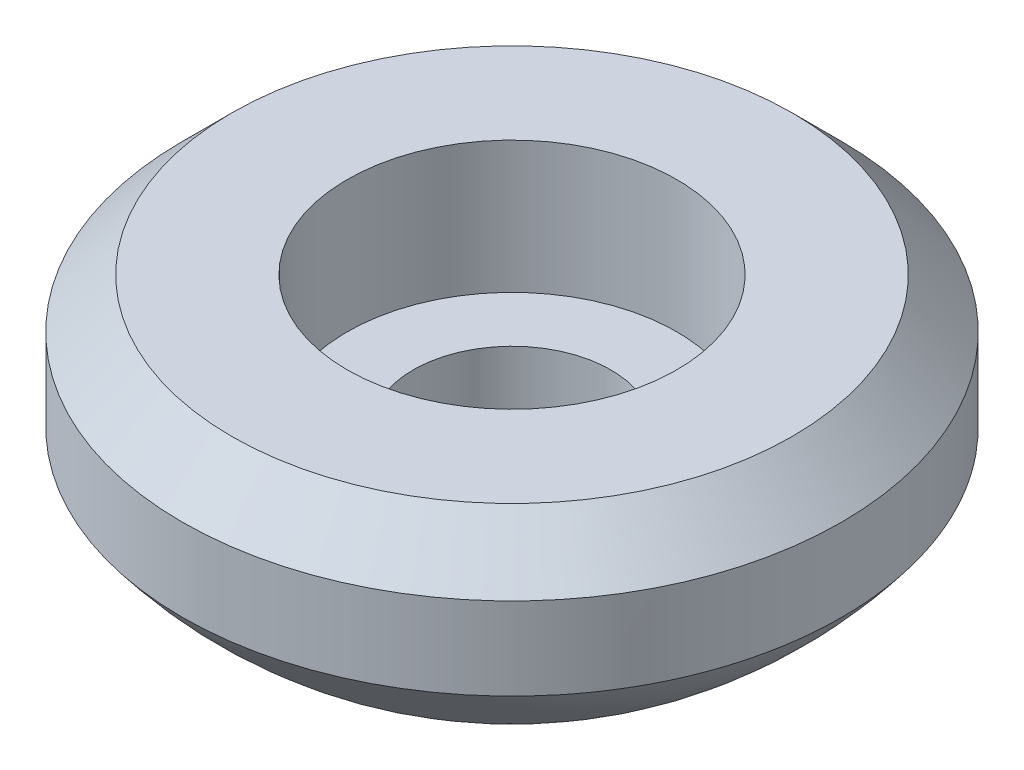
ISO-10303-21;
HEADER;
FILE_DESCRIPTION(('STEP AP214'),'2;1');
FILE_NAME('part.step','',(''),(''),'','','');
FILE_SCHEMA(('AUTOMOTIVE_DESIGN { 1 0 10303 214 1 1 1 1 }'));
ENDSEC;
DATA;
#1=APPLICATION_CONTEXT('core data for automotive mechanical design processes');
#2=APPLICATION_PROTOCOL_DEFINITION('international standard','automotive_design',2000,#1);
#3=PRODUCT_CONTEXT('',#1,'mechanical');
#4=PRODUCT('Part','Part','',(#3));
#5=PRODUCT_RELATED_PRODUCT_CATEGORY('part','',(#4));
#6=PRODUCT_DEFINITION_FORMATION('','',#4);
#7=PRODUCT_DEFINITION_CONTEXT('part definition',#1,'design');
#8=PRODUCT_DEFINITION('design','',#6,#7);
#9=PRODUCT_DEFINITION_SHAPE('','',#8);
#10=(LENGTH_UNIT() NAMED_UNIT(*) SI_UNIT(.MILLI.,.METRE.));
#11=(NAMED_UNIT(*) PLANE_ANGLE_UNIT() SI_UNIT($,.RADIAN.));
#12=(NAMED_UNIT(*) SI_UNIT($,.STERADIAN.) SOLID_ANGLE_UNIT());
#13=UNCERTAINTY_MEASURE_WITH_UNIT(LENGTH_MEASURE(1.E-05),#10,'distance_accuracy_value','');
#14=(GEOMETRIC_REPRESENTATION_CONTEXT(3) GLOBAL_UNCERTAINTY_ASSIGNED_CONTEXT((#13)) GLOBAL_UNIT_ASSIGNED_CONTEXT((#10,
#11,#12)) REPRESENTATION_CONTEXT('',''));
#15=CARTESIAN_POINT('',(0.,0.,0.));
#16=DIRECTION('',(0.,0.,1.));
#17=DIRECTION('',(1.,0.,0.));
#18=AXIS2_PLACEMENT_3D('',#15,#16,#17);
#19=CARTESIAN_POINT('',(0.,25.0000000000002,0.));
#20=DIRECTION('',(-1.,0.,0.));
#21=DIRECTION('',(0.,0.,1.));
#22=AXIS2_PLACEMENT_3D('',#19,#20,#21);
#23=SPHERICAL_SURFACE('',#22,25.0000000000002);
#24=CARTESIAN_POINT('',(0.,9.99999999999971,0.));
#25=DIRECTION('',(0.,1.,0.));
#26=DIRECTION('',(0.,0.,1.));
#27=AXIS2_PLACEMENT_3D('',#24,#25,#26);
#28=CIRCLE('',#27,19.9999999999999);
#29=CARTESIAN_POINT('',(0.,9.99999999999971,19.9999999999999));
#30=VERTEX_POINT('',#29);
#31=EDGE_CURVE('E82',#30,#30,#28,.T.);
#32=ORIENTED_EDGE('',*,*,#31,.F.);
#33=EDGE_LOOP('',(#32));
#34=FACE_BOUND('',#33,.T.);
#35=CARTESIAN_POINT('',(0.,0.73067780097677,0.));
#36=DIRECTION('',(0.,1.,0.));
#37=DIRECTION('',(0.,0.,1.));
#38=AXIS2_PLACEMENT_3D('',#35,#36,#37);
#39=CIRCLE('',#38,5.99999999999999);
#40=CARTESIAN_POINT('',(0.,0.73067780097677,5.99999999999999));
#41=VERTEX_POINT('',#40);
#42=EDGE_CURVE('E55',#41,#41,#39,.T.);
#43=ORIENTED_EDGE('',*,*,#42,.T.);
#44=EDGE_LOOP('',(#43));
#45=FACE_BOUND('',#44,.T.);
#46=ADVANCED_FACE('F35',(#34,#45),#23,.T.);
#47=CARTESIAN_POINT('',(0.,18.,0.));
#48=DIRECTION('',(0.,-1.,0.));
#49=DIRECTION('',(0.,0.,-1.));
#50=AXIS2_PLACEMENT_3D('',#47,#48,#49);
#51=CYLINDRICAL_SURFACE('',#50,19.9999999999999);
#52=CARTESIAN_POINT('',(0.,15.,0.));
#53=DIRECTION('',(0.,1.,0.));
#54=DIRECTION('',(0.,0.,1.));
#55=AXIS2_PLACEMENT_3D('',#52,#53,#54);
#56=CIRCLE('',#55,19.9999999999999);
#57=CARTESIAN_POINT('',(0.,15.,-19.9999999999999));
#58=VERTEX_POINT('',#57);
#59=EDGE_CURVE('E10',#58,#58,#56,.F.);
#60=ORIENTED_EDGE('',*,*,#59,.T.);
#61=EDGE_LOOP('',(#60));
#62=FACE_BOUND('',#61,.T.);
#63=ORIENTED_EDGE('',*,*,#31,.T.);
#64=EDGE_LOOP('',(#63));
#65=FACE_BOUND('',#64,.T.);
#66=ADVANCED_FACE('F59',(#62,#65),#51,.T.);
#67=CARTESIAN_POINT('',(0.,18.,0.));
#68=DIRECTION('',(0.,1.,0.));
#69=DIRECTION('',(0.,0.,1.));
#70=AXIS2_PLACEMENT_3D('',#67,#68,#69);
#71=PLANE('',#70);
#72=CARTESIAN_POINT('',(0.,18.,0.));
#73=DIRECTION('',(0.,1.,0.));
#74=DIRECTION('',(0.,0.,1.));
#75=AXIS2_PLACEMENT_3D('',#72,#73,#74);
#76=CIRCLE('',#75,16.9999999999999);
#77=CARTESIAN_POINT('',(0.,18.,-16.9999999999999));
#78=VERTEX_POINT('',#77);
#79=EDGE_CURVE('E42',#78,#78,#76,.T.);
#80=ORIENTED_EDGE('',*,*,#79,.T.);
#81=EDGE_LOOP('',(#80));
#82=FACE_BOUND('',#81,.T.);
#83=CARTESIAN_POINT('',(0.,18.,0.));
#84=DIRECTION('',(0.,1.,0.));
#85=DIRECTION('',(0.,0.,1.));
#86=AXIS2_PLACEMENT_3D('',#83,#84,#85);
#87=CIRCLE('',#86,10.);
#88=CARTESIAN_POINT('',(0.,18.,10.));
#89=VERTEX_POINT('',#88);
#90=EDGE_CURVE('E84',#89,#89,#87,.T.);
#91=ORIENTED_EDGE('',*,*,#90,.F.);
#92=EDGE_LOOP('',(#91));
#93=FACE_BOUND('',#92,.T.);
#94=ADVANCED_FACE('F65',(#82,#93),#71,.T.);
#95=CARTESIAN_POINT('',(0.,18.,0.));
#96=DIRECTION('',(0.,1.,0.));
#97=DIRECTION('',(0.,0.,1.));
#98=AXIS2_PLACEMENT_3D('',#95,#96,#97);
#99=CYLINDRICAL_SURFACE('',#98,10.);
#100=CARTESIAN_POINT('',(0.,9.99999999999999,0.));
#101=DIRECTION('',(0.,1.,0.));
#102=DIRECTION('',(0.,0.,1.));
#103=AXIS2_PLACEMENT_3D('',#100,#101,#102);
#104=CIRCLE('',#103,10.);
#105=CARTESIAN_POINT('',(0.,9.99999999999999,10.));
#106=VERTEX_POINT('',#105);
#107=EDGE_CURVE('E50',#106,#106,#104,.T.);
#108=ORIENTED_EDGE('',*,*,#107,.F.);
#109=EDGE_LOOP('',(#108));
#110=FACE_BOUND('',#109,.T.);
#111=ORIENTED_EDGE('',*,*,#90,.T.);
#112=EDGE_LOOP('',(#111));
#113=FACE_BOUND('',#112,.T.);
#114=ADVANCED_FACE('F61',(#110,#113),#99,.F.);
#115=CARTESIAN_POINT('',(5.99999999999999,10.,0.));
#116=DIRECTION('',(0.,-1.,0.));
#117=DIRECTION('',(0.,0.,-1.));
#118=AXIS2_PLACEMENT_3D('',#115,#116,#117);
#119=PLANE('',#118);
#120=CARTESIAN_POINT('',(0.,10.,0.));
#121=DIRECTION('',(0.,1.,0.));
#122=DIRECTION('',(0.,0.,1.));
#123=AXIS2_PLACEMENT_3D('',#120,#121,#122);
#124=CIRCLE('',#123,5.99999999999999);
#125=CARTESIAN_POINT('',(0.,10.,5.99999999999999));
#126=VERTEX_POINT('',#125);
#127=EDGE_CURVE('E46',#126,#126,#124,.T.);
#128=ORIENTED_EDGE('',*,*,#127,.F.);
#129=EDGE_LOOP('',(#128));
#130=FACE_BOUND('',#129,.T.);
#131=ORIENTED_EDGE('',*,*,#107,.T.);
#132=EDGE_LOOP('',(#131));
#133=FACE_BOUND('',#132,.T.);
#134=ADVANCED_FACE('F64',(#130,#133),#119,.F.);
#135=CARTESIAN_POINT('',(0.,18.,0.));
#136=DIRECTION('',(0.,1.,0.));
#137=DIRECTION('',(0.,0.,1.));
#138=AXIS2_PLACEMENT_3D('',#135,#136,#137);
#139=CYLINDRICAL_SURFACE('',#138,5.99999999999999);
#140=ORIENTED_EDGE('',*,*,#42,.F.);
#141=EDGE_LOOP('',(#140));
#142=FACE_BOUND('',#141,.T.);
#143=ORIENTED_EDGE('',*,*,#127,.T.);
#144=EDGE_LOOP('',(#143));
#145=FACE_BOUND('',#144,.T.);
#146=ADVANCED_FACE('F69',(#142,#145),#139,.F.);
#147=CARTESIAN_POINT('',(0.,18.,0.));
#148=DIRECTION('',(0.,-1.,0.));
#149=DIRECTION('',(0.,0.,-1.));
#150=AXIS2_PLACEMENT_3D('',#147,#148,#149);
#151=CONICAL_SURFACE('',#150,16.9999999999999,0.785398163397459);
#152=CARTESIAN_POINT('',(0.,15.,-19.9999999999999));
#153=CARTESIAN_POINT('',(0.,15.03125,-19.9687499999999));
#154=CARTESIAN_POINT('',(0.,15.0625,-19.9374999999999));
#155=CARTESIAN_POINT('',(0.,15.125,-19.8749999999999));
#156=CARTESIAN_POINT('',(0.,15.15625,-19.8437499999999));
#157=CARTESIAN_POINT('',(0.,15.21875,-19.7812499999999));
#158=CARTESIAN_POINT('',(0.,15.25,-19.7499999999999));
#159=CARTESIAN_POINT('',(0.,15.3125,-19.6874999999999));
#160=CARTESIAN_POINT('',(0.,15.34375,-19.6562499999999));
#161=CARTESIAN_POINT('',(0.,15.40625,-19.5937499999999));
#162=CARTESIAN_POINT('',(0.,15.4375,-19.5624999999999));
#163=CARTESIAN_POINT('',(0.,15.5,-19.4999999999999));
#164=CARTESIAN_POINT('',(0.,15.53125,-19.4687499999999));
#165=CARTESIAN_POINT('',(0.,15.59375,-19.4062499999999));
#166=CARTESIAN_POINT('',(0.,15.625,-19.3749999999999));
#167=CARTESIAN_POINT('',(0.,15.6875,-19.3124999999999));
#168=CARTESIAN_POINT('',(0.,15.71875,-19.2812499999999));
#169=CARTESIAN_POINT('',(0.,15.78125,-19.2187499999999));
#170=CARTESIAN_POINT('',(0.,15.8125,-19.1874999999999));
#171=CARTESIAN_POINT('',(0.,15.875,-19.1249999999999));
#172=CARTESIAN_POINT('',(0.,15.90625,-19.0937499999999));
#173=CARTESIAN_POINT('',(0.,15.96875,-19.0312499999999));
#174=CARTESIAN_POINT('',(0.,16.,-18.9999999999999));
#175=CARTESIAN_POINT('',(0.,16.0625,-18.9374999999999));
#176=CARTESIAN_POINT('',(0.,16.09375,-18.9062499999999));
#177=CARTESIAN_POINT('',(0.,16.15625,-18.8437499999999));
#178=CARTESIAN_POINT('',(0.,16.1875,-18.8124999999999));
#179=CARTESIAN_POINT('',(0.,16.25,-18.7499999999999));
#180=CARTESIAN_POINT('',(0.,16.28125,-18.7187499999999));
#181=CARTESIAN_POINT('',(0.,16.34375,-18.6562499999999));
#182=CARTESIAN_POINT('',(0.,16.375,-18.6249999999999));
#183=CARTESIAN_POINT('',(0.,16.4375,-18.5624999999999));
#184=CARTESIAN_POINT('',(0.,16.46875,-18.5312499999999));
#185=CARTESIAN_POINT('',(0.,16.53125,-18.4687499999999));
#186=CARTESIAN_POINT('',(0.,16.5625,-18.4374999999999));
#187=CARTESIAN_POINT('',(0.,16.625,-18.3749999999999));
#188=CARTESIAN_POINT('',(0.,16.65625,-18.3437499999999));
#189=CARTESIAN_POINT('',(0.,16.71875,-18.2812499999999));
#190=CARTESIAN_POINT('',(0.,16.75,-18.2499999999999));
#191=CARTESIAN_POINT('',(0.,16.8125,-18.1874999999999));
#192=CARTESIAN_POINT('',(0.,16.84375,-18.1562499999999));
#193=CARTESIAN_POINT('',(0.,16.90625,-18.0937499999999));
#194=CARTESIAN_POINT('',(0.,16.9375,-18.0624999999999));
#195=CARTESIAN_POINT('',(0.,17.,-17.9999999999999));
#196=CARTESIAN_POINT('',(0.,17.03125,-17.9687499999999));
#197=CARTESIAN_POINT('',(0.,17.09375,-17.9062499999999));
#198=CARTESIAN_POINT('',(0.,17.125,-17.8749999999999));
#199=CARTESIAN_POINT('',(0.,17.1875,-17.8124999999999));
#200=CARTESIAN_POINT('',(0.,17.21875,-17.7812499999999));
#201=CARTESIAN_POINT('',(0.,17.28125,-17.7187499999999));
#202=CARTESIAN_POINT('',(0.,17.3125,-17.6874999999999));
#203=CARTESIAN_POINT('',(0.,17.375,-17.6249999999999));
#204=CARTESIAN_POINT('',(0.,17.40625,-17.5937499999999));
#205=CARTESIAN_POINT('',(0.,17.46875,-17.5312499999999));
#206=CARTESIAN_POINT('',(0.,17.5,-17.4999999999999));
#207=CARTESIAN_POINT('',(0.,17.5625,-17.4374999999999));
#208=CARTESIAN_POINT('',(0.,17.59375,-17.4062499999999));
#209=CARTESIAN_POINT('',(0.,17.65625,-17.3437499999999));
#210=CARTESIAN_POINT('',(0.,17.6875,-17.3124999999999));
#211=CARTESIAN_POINT('',(0.,17.75,-17.2499999999999));
#212=CARTESIAN_POINT('',(0.,17.78125,-17.2187499999999));
#213=CARTESIAN_POINT('',(0.,17.84375,-17.1562499999999));
#214=CARTESIAN_POINT('',(0.,17.875,-17.1249999999999));
#215=CARTESIAN_POINT('',(0.,17.9375,-17.0624999999999));
#216=CARTESIAN_POINT('',(0.,17.96875,-17.0312499999999));
#217=CARTESIAN_POINT('',(0.,18.,-16.9999999999999));
#218=B_SPLINE_CURVE_WITH_KNOTS('',3,(#152,#153,#154,#155,#156,#157,#158,#159,#160,#161,#162,
#163,#164,#165,#166,#167,#168,#169,#170,#171,#172,#173,#174,#175,#176,#177,#178,#179,#180,#181,
#182,#183,#184,#185,#186,#187,#188,#189,#190,#191,#192,#193,#194,#195,#196,#197,#198,#199,#200,
#201,#202,#203,#204,#205,#206,#207,#208,#209,#210,#211,#212,#213,#214,#215,#216,#217),
.UNSPECIFIED.,.F.,.F.,(4,2,2,2,2,2,2,2,2,2,2,2,2,2,2,2,2,2,2,2,2,2,2,2,2,2,2,2,2,2,2,2,4),(0.,
0.132582521472478,0.265165042944954,0.397747564417435,0.530330085889911,0.662912607362389,
0.795495128834868,0.928077650307346,1.06066017177982,1.1932426932523,1.32582521472478,
1.45840773619726,1.59099025766973,1.72357277914221,1.85615530061469,1.98873782208717,
2.12132034355965,2.25390286503212,2.3864853865046,2.51906790797708,2.65165042944956,
2.78423295092203,2.91681547239451,3.04939799386699,3.18198051533947,3.31456303681195,
3.44714555828443,3.5797280797569,3.71231060122938,3.84489312270186,3.97747564417434,
4.11005816564681,4.24264068711929),.UNSPECIFIED.);
#219=EDGE_CURVE('BSEAM37',#58,#78,#218,.T.);
#220=ORIENTED_EDGE('',*,*,#59,.F.);
#221=ORIENTED_EDGE('',*,*,#79,.F.);
#222=ORIENTED_EDGE('',*,*,#219,.T.);
#223=ORIENTED_EDGE('',*,*,#219,.F.);
#224=EDGE_LOOP('',(#220,#222,#221,#223));
#225=FACE_BOUND('',#224,.T.);
#226=ADVANCED_FACE('F37',(#225),#151,.T.);
#227=CLOSED_SHELL('',(#46,#66,#94,#114,#134,#146,#226));
#228=MANIFOLD_SOLID_BREP('B2',#227);
#229=ADVANCED_BREP_SHAPE_REPRESENTATION('',(#18,#228),#14);
#230=SHAPE_DEFINITION_REPRESENTATION(#9,#229);
ENDSEC;
END-ISO-10303-21;
